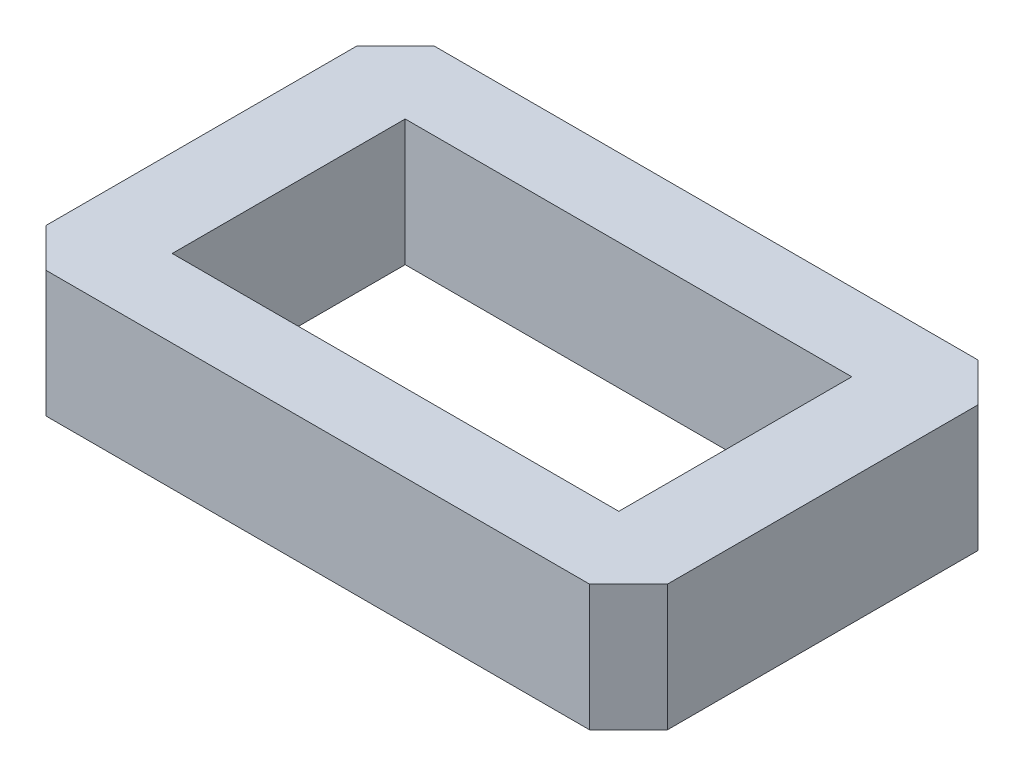
ISO-10303-21;
HEADER;
FILE_DESCRIPTION(('STEP AP214'),'2;1');
FILE_NAME('part.step','',(''),(''),'','','');
FILE_SCHEMA(('AUTOMOTIVE_DESIGN { 1 0 10303 214 1 1 1 1 }'));
ENDSEC;
DATA;
#1=APPLICATION_CONTEXT('core data for automotive mechanical design processes');
#2=APPLICATION_PROTOCOL_DEFINITION('international standard','automotive_design',2000,#1);
#3=PRODUCT_CONTEXT('',#1,'mechanical');
#4=PRODUCT('Part','Part','',(#3));
#5=PRODUCT_RELATED_PRODUCT_CATEGORY('part','',(#4));
#6=PRODUCT_DEFINITION_FORMATION('','',#4);
#7=PRODUCT_DEFINITION_CONTEXT('part definition',#1,'design');
#8=PRODUCT_DEFINITION('design','',#6,#7);
#9=PRODUCT_DEFINITION_SHAPE('','',#8);
#10=(LENGTH_UNIT() NAMED_UNIT(*) SI_UNIT(.MILLI.,.METRE.));
#11=(NAMED_UNIT(*) PLANE_ANGLE_UNIT() SI_UNIT($,.RADIAN.));
#12=(NAMED_UNIT(*) SI_UNIT($,.STERADIAN.) SOLID_ANGLE_UNIT());
#13=UNCERTAINTY_MEASURE_WITH_UNIT(LENGTH_MEASURE(1.E-05),#10,'distance_accuracy_value','');
#14=(GEOMETRIC_REPRESENTATION_CONTEXT(3) GLOBAL_UNCERTAINTY_ASSIGNED_CONTEXT((#13)) GLOBAL_UNIT_ASSIGNED_CONTEXT((#10,
#11,#12)) REPRESENTATION_CONTEXT('',''));
#15=CARTESIAN_POINT('',(0.,0.,0.));
#16=DIRECTION('',(0.,0.,1.));
#17=DIRECTION('',(1.,0.,0.));
#18=AXIS2_PLACEMENT_3D('',#15,#16,#17);
#19=CARTESIAN_POINT('',(0.,6.5,0.));
#20=DIRECTION('',(1.,0.,0.));
#21=DIRECTION('',(0.,0.,-1.));
#22=AXIS2_PLACEMENT_3D('',#19,#20,#21);
#23=PLANE('',#22);
#24=DIRECTION('',(0.,0.,1.));
#25=VECTOR('',#24,1.);
#26=CARTESIAN_POINT('',(0.,6.5,0.));
#27=LINE('',#26,#25);
#28=CARTESIAN_POINT('',(0.,6.5,-18.));
#29=VERTEX_POINT('',#28);
#30=CARTESIAN_POINT('',(0.,6.5,-2.));
#31=VERTEX_POINT('',#30);
#32=EDGE_CURVE('E197',#29,#31,#27,.T.);
#33=ORIENTED_EDGE('',*,*,#32,.F.);
#34=DIRECTION('',(0.,-1.,0.));
#35=VECTOR('',#34,1.);
#36=CARTESIAN_POINT('',(0.,6.5,-18.));
#37=LINE('',#36,#35);
#38=CARTESIAN_POINT('',(0.,0.,-18.));
#39=VERTEX_POINT('',#38);
#40=EDGE_CURVE('E228',#29,#39,#37,.T.);
#41=ORIENTED_EDGE('',*,*,#40,.T.);
#42=DIRECTION('',(0.,0.,1.));
#43=VECTOR('',#42,1.);
#44=CARTESIAN_POINT('',(0.,0.,0.));
#45=LINE('',#44,#43);
#46=CARTESIAN_POINT('',(0.,0.,-2.));
#47=VERTEX_POINT('',#46);
#48=EDGE_CURVE('E191',#39,#47,#45,.T.);
#49=ORIENTED_EDGE('',*,*,#48,.T.);
#50=DIRECTION('',(0.,1.,0.));
#51=VECTOR('',#50,1.);
#52=CARTESIAN_POINT('',(0.,6.5,-2.));
#53=LINE('',#52,#51);
#54=EDGE_CURVE('E212',#47,#31,#53,.T.);
#55=ORIENTED_EDGE('',*,*,#54,.T.);
#56=EDGE_LOOP('',(#33,#41,#49,#55));
#57=FACE_BOUND('',#56,.T.);
#58=ADVANCED_FACE('F49',(#57),#23,.F.);
#59=CARTESIAN_POINT('',(0.,6.5,0.));
#60=DIRECTION('',(0.,0.,-1.));
#61=DIRECTION('',(-1.,0.,0.));
#62=AXIS2_PLACEMENT_3D('',#59,#60,#61);
#63=PLANE('',#62);
#64=DIRECTION('',(1.,0.,0.));
#65=VECTOR('',#64,1.);
#66=CARTESIAN_POINT('',(0.,0.,0.));
#67=LINE('',#66,#65);
#68=CARTESIAN_POINT('',(2.,0.,0.));
#69=VERTEX_POINT('',#68);
#70=CARTESIAN_POINT('',(30.,0.,0.));
#71=VERTEX_POINT('',#70);
#72=EDGE_CURVE('E216',#69,#71,#67,.T.);
#73=ORIENTED_EDGE('',*,*,#72,.T.);
#74=DIRECTION('',(0.,1.,0.));
#75=VECTOR('',#74,1.);
#76=CARTESIAN_POINT('',(30.,6.5,0.));
#77=LINE('',#76,#75);
#78=CARTESIAN_POINT('',(30.,6.5,0.));
#79=VERTEX_POINT('',#78);
#80=EDGE_CURVE('E11',#71,#79,#77,.T.);
#81=ORIENTED_EDGE('',*,*,#80,.T.);
#82=DIRECTION('',(1.,0.,0.));
#83=VECTOR('',#82,1.);
#84=CARTESIAN_POINT('',(0.,6.5,0.));
#85=LINE('',#84,#83);
#86=CARTESIAN_POINT('',(2.,6.5,0.));
#87=VERTEX_POINT('',#86);
#88=EDGE_CURVE('E201',#87,#79,#85,.T.);
#89=ORIENTED_EDGE('',*,*,#88,.F.);
#90=DIRECTION('',(0.,-1.,0.));
#91=VECTOR('',#90,1.);
#92=CARTESIAN_POINT('',(2.,6.5,0.));
#93=LINE('',#92,#91);
#94=EDGE_CURVE('E59',#87,#69,#93,.T.);
#95=ORIENTED_EDGE('',*,*,#94,.T.);
#96=EDGE_LOOP('',(#73,#81,#89,#95));
#97=FACE_BOUND('',#96,.T.);
#98=ADVANCED_FACE('F273',(#97),#63,.F.);
#99=CARTESIAN_POINT('',(32.,6.5,0.));
#100=DIRECTION('',(-1.,0.,0.));
#101=DIRECTION('',(0.,0.,1.));
#102=AXIS2_PLACEMENT_3D('',#99,#100,#101);
#103=PLANE('',#102);
#104=DIRECTION('',(0.,0.,-1.));
#105=VECTOR('',#104,1.);
#106=CARTESIAN_POINT('',(32.,0.,0.));
#107=LINE('',#106,#105);
#108=CARTESIAN_POINT('',(32.,0.,-2.));
#109=VERTEX_POINT('',#108);
#110=CARTESIAN_POINT('',(32.,0.,-18.));
#111=VERTEX_POINT('',#110);
#112=EDGE_CURVE('E220',#109,#111,#107,.T.);
#113=ORIENTED_EDGE('',*,*,#112,.T.);
#114=DIRECTION('',(0.,1.,0.));
#115=VECTOR('',#114,1.);
#116=CARTESIAN_POINT('',(32.,6.5,-18.));
#117=LINE('',#116,#115);
#118=CARTESIAN_POINT('',(32.,6.5,-18.));
#119=VERTEX_POINT('',#118);
#120=EDGE_CURVE('E66',#111,#119,#117,.T.);
#121=ORIENTED_EDGE('',*,*,#120,.T.);
#122=DIRECTION('',(0.,0.,-1.));
#123=VECTOR('',#122,1.);
#124=CARTESIAN_POINT('',(32.,6.5,0.));
#125=LINE('',#124,#123);
#126=CARTESIAN_POINT('',(32.,6.5,-2.));
#127=VERTEX_POINT('',#126);
#128=EDGE_CURVE('E205',#127,#119,#125,.T.);
#129=ORIENTED_EDGE('',*,*,#128,.F.);
#130=DIRECTION('',(0.,-1.,0.));
#131=VECTOR('',#130,1.);
#132=CARTESIAN_POINT('',(32.,6.5,-2.));
#133=LINE('',#132,#131);
#134=EDGE_CURVE('E262',#127,#109,#133,.T.);
#135=ORIENTED_EDGE('',*,*,#134,.T.);
#136=EDGE_LOOP('',(#113,#121,#129,#135));
#137=FACE_BOUND('',#136,.T.);
#138=ADVANCED_FACE('F282',(#137),#103,.F.);
#139=CARTESIAN_POINT('',(0.,6.5,-20.));
#140=DIRECTION('',(0.,0.,1.));
#141=DIRECTION('',(1.,0.,0.));
#142=AXIS2_PLACEMENT_3D('',#139,#140,#141);
#143=PLANE('',#142);
#144=DIRECTION('',(-1.,0.,0.));
#145=VECTOR('',#144,1.);
#146=CARTESIAN_POINT('',(0.,0.,-20.));
#147=LINE('',#146,#145);
#148=CARTESIAN_POINT('',(30.,0.,-20.));
#149=VERTEX_POINT('',#148);
#150=CARTESIAN_POINT('',(2.,0.,-20.));
#151=VERTEX_POINT('',#150);
#152=EDGE_CURVE('E202',#149,#151,#147,.T.);
#153=ORIENTED_EDGE('',*,*,#152,.T.);
#154=DIRECTION('',(0.,1.,0.));
#155=VECTOR('',#154,1.);
#156=CARTESIAN_POINT('',(2.,6.5,-20.));
#157=LINE('',#156,#155);
#158=CARTESIAN_POINT('',(2.,6.5,-20.));
#159=VERTEX_POINT('',#158);
#160=EDGE_CURVE('E248',#151,#159,#157,.T.);
#161=ORIENTED_EDGE('',*,*,#160,.T.);
#162=DIRECTION('',(-1.,0.,0.));
#163=VECTOR('',#162,1.);
#164=CARTESIAN_POINT('',(0.,6.5,-20.));
#165=LINE('',#164,#163);
#166=CARTESIAN_POINT('',(30.,6.5,-20.));
#167=VERTEX_POINT('',#166);
#168=EDGE_CURVE('E208',#167,#159,#165,.T.);
#169=ORIENTED_EDGE('',*,*,#168,.F.);
#170=DIRECTION('',(0.,-1.,0.));
#171=VECTOR('',#170,1.);
#172=CARTESIAN_POINT('',(30.,6.5,-20.));
#173=LINE('',#172,#171);
#174=EDGE_CURVE('E244',#167,#149,#173,.T.);
#175=ORIENTED_EDGE('',*,*,#174,.T.);
#176=EDGE_LOOP('',(#153,#161,#169,#175));
#177=FACE_BOUND('',#176,.T.);
#178=ADVANCED_FACE('F291',(#177),#143,.F.);
#179=CARTESIAN_POINT('',(0.,6.5,0.));
#180=DIRECTION('',(0.,-1.,0.));
#181=DIRECTION('',(0.,0.,-1.));
#182=AXIS2_PLACEMENT_3D('',#179,#180,#181);
#183=PLANE('',#182);
#184=DIRECTION('',(-1.,0.,0.));
#185=VECTOR('',#184,1.);
#186=CARTESIAN_POINT('',(4.5,6.5,-16.));
#187=LINE('',#186,#185);
#188=CARTESIAN_POINT('',(27.5,6.5,-16.));
#189=VERTEX_POINT('',#188);
#190=CARTESIAN_POINT('',(4.5,6.5,-16.));
#191=VERTEX_POINT('',#190);
#192=EDGE_CURVE('E182',#189,#191,#187,.T.);
#193=ORIENTED_EDGE('',*,*,#192,.F.);
#194=DIRECTION('',(0.,0.,-1.));
#195=VECTOR('',#194,1.);
#196=CARTESIAN_POINT('',(27.5,6.5,-4.));
#197=LINE('',#196,#195);
#198=CARTESIAN_POINT('',(27.5,6.5,-4.));
#199=VERTEX_POINT('',#198);
#200=EDGE_CURVE('E148',#199,#189,#197,.T.);
#201=ORIENTED_EDGE('',*,*,#200,.F.);
#202=DIRECTION('',(1.,0.,0.));
#203=VECTOR('',#202,1.);
#204=CARTESIAN_POINT('',(4.5,6.5,-4.));
#205=LINE('',#204,#203);
#206=CARTESIAN_POINT('',(4.5,6.5,-4.));
#207=VERTEX_POINT('',#206);
#208=EDGE_CURVE('E169',#207,#199,#205,.T.);
#209=ORIENTED_EDGE('',*,*,#208,.F.);
#210=DIRECTION('',(0.,0.,1.));
#211=VECTOR('',#210,1.);
#212=CARTESIAN_POINT('',(4.5,6.5,-4.));
#213=LINE('',#212,#211);
#214=EDGE_CURVE('E173',#191,#207,#213,.T.);
#215=ORIENTED_EDGE('',*,*,#214,.F.);
#216=EDGE_LOOP('',(#193,#201,#209,#215));
#217=FACE_BOUND('',#216,.T.);
#218=ORIENTED_EDGE('',*,*,#168,.T.);
#219=DIRECTION('',(0.707106781186548,0.,-0.707106781186547));
#220=VECTOR('',#219,1.);
#221=CARTESIAN_POINT('',(0.,6.5,-18.));
#222=LINE('',#221,#220);
#223=EDGE_CURVE('E259',#159,#29,#222,.F.);
#224=ORIENTED_EDGE('',*,*,#223,.T.);
#225=ORIENTED_EDGE('',*,*,#32,.T.);
#226=DIRECTION('',(-0.707106781186546,0.,-0.707106781186549));
#227=VECTOR('',#226,1.);
#228=CARTESIAN_POINT('',(2.,6.5,0.));
#229=LINE('',#228,#227);
#230=EDGE_CURVE('E251',#31,#87,#229,.F.);
#231=ORIENTED_EDGE('',*,*,#230,.T.);
#232=ORIENTED_EDGE('',*,*,#88,.T.);
#233=DIRECTION('',(-0.707106781186549,0.,0.707106781186546));
#234=VECTOR('',#233,1.);
#235=CARTESIAN_POINT('',(32.,6.5,-2.));
#236=LINE('',#235,#234);
#237=EDGE_CURVE('E73',#79,#127,#236,.F.);
#238=ORIENTED_EDGE('',*,*,#237,.T.);
#239=ORIENTED_EDGE('',*,*,#128,.T.);
#240=DIRECTION('',(0.707106781186546,0.,0.707106781186549));
#241=VECTOR('',#240,1.);
#242=CARTESIAN_POINT('',(30.,6.5,-20.));
#243=LINE('',#242,#241);
#244=EDGE_CURVE('E256',#119,#167,#243,.F.);
#245=ORIENTED_EDGE('',*,*,#244,.T.);
#246=EDGE_LOOP('',(#218,#224,#225,#231,#232,#238,#239,#245));
#247=FACE_BOUND('',#246,.T.);
#248=ADVANCED_FACE('F284',(#217,#247),#183,.F.);
#249=CARTESIAN_POINT('',(0.,0.,0.));
#250=DIRECTION('',(0.,-1.,0.));
#251=DIRECTION('',(0.,0.,-1.));
#252=AXIS2_PLACEMENT_3D('',#249,#250,#251);
#253=PLANE('',#252);
#254=DIRECTION('',(0.,0.,-1.));
#255=VECTOR('',#254,1.);
#256=CARTESIAN_POINT('',(27.5,0.,-4.));
#257=LINE('',#256,#255);
#258=CARTESIAN_POINT('',(27.5,0.,-4.));
#259=VERTEX_POINT('',#258);
#260=CARTESIAN_POINT('',(27.5,0.,-16.));
#261=VERTEX_POINT('',#260);
#262=EDGE_CURVE('E145',#259,#261,#257,.T.);
#263=ORIENTED_EDGE('',*,*,#262,.T.);
#264=DIRECTION('',(-1.,0.,0.));
#265=VECTOR('',#264,1.);
#266=CARTESIAN_POINT('',(4.5,0.,-16.));
#267=LINE('',#266,#265);
#268=CARTESIAN_POINT('',(4.5,0.,-16.));
#269=VERTEX_POINT('',#268);
#270=EDGE_CURVE('E158',#261,#269,#267,.T.);
#271=ORIENTED_EDGE('',*,*,#270,.T.);
#272=DIRECTION('',(0.,0.,1.));
#273=VECTOR('',#272,1.);
#274=CARTESIAN_POINT('',(4.5,0.,-4.));
#275=LINE('',#274,#273);
#276=CARTESIAN_POINT('',(4.5,0.,-4.));
#277=VERTEX_POINT('',#276);
#278=EDGE_CURVE('E163',#269,#277,#275,.T.);
#279=ORIENTED_EDGE('',*,*,#278,.T.);
#280=DIRECTION('',(1.,0.,0.));
#281=VECTOR('',#280,1.);
#282=CARTESIAN_POINT('',(4.5,0.,-4.));
#283=LINE('',#282,#281);
#284=EDGE_CURVE('E154',#277,#259,#283,.T.);
#285=ORIENTED_EDGE('',*,*,#284,.T.);
#286=EDGE_LOOP('',(#263,#271,#279,#285));
#287=FACE_BOUND('',#286,.T.);
#288=ORIENTED_EDGE('',*,*,#48,.F.);
#289=DIRECTION('',(-0.707106781186548,0.,0.707106781186547));
#290=VECTOR('',#289,1.);
#291=CARTESIAN_POINT('',(-9.,0.,-9.00000000000001));
#292=LINE('',#291,#290);
#293=EDGE_CURVE('E241',#39,#151,#292,.F.);
#294=ORIENTED_EDGE('',*,*,#293,.T.);
#295=ORIENTED_EDGE('',*,*,#152,.F.);
#296=DIRECTION('',(-0.707106781186546,0.,-0.707106781186549));
#297=VECTOR('',#296,1.);
#298=CARTESIAN_POINT('',(25.0000000000001,0.,-25.));
#299=LINE('',#298,#297);
#300=EDGE_CURVE('E238',#149,#111,#299,.F.);
#301=ORIENTED_EDGE('',*,*,#300,.T.);
#302=ORIENTED_EDGE('',*,*,#112,.F.);
#303=DIRECTION('',(0.707106781186549,0.,-0.707106781186546));
#304=VECTOR('',#303,1.);
#305=CARTESIAN_POINT('',(14.9999999999999,0.,15.));
#306=LINE('',#305,#304);
#307=EDGE_CURVE('E235',#109,#71,#306,.F.);
#308=ORIENTED_EDGE('',*,*,#307,.T.);
#309=ORIENTED_EDGE('',*,*,#72,.F.);
#310=DIRECTION('',(0.707106781186546,0.,0.707106781186549));
#311=VECTOR('',#310,1.);
#312=CARTESIAN_POINT('',(1.,0.,-0.999999999999998));
#313=LINE('',#312,#311);
#314=EDGE_CURVE('E232',#69,#47,#313,.F.);
#315=ORIENTED_EDGE('',*,*,#314,.T.);
#316=EDGE_LOOP('',(#288,#294,#295,#301,#302,#308,#309,#315));
#317=FACE_BOUND('',#316,.T.);
#318=ADVANCED_FACE('F165',(#287,#317),#253,.T.);
#319=CARTESIAN_POINT('',(27.5,0.,-4.));
#320=DIRECTION('',(1.,0.,0.));
#321=DIRECTION('',(0.,0.,-1.));
#322=AXIS2_PLACEMENT_3D('',#319,#320,#321);
#323=PLANE('',#322);
#324=ORIENTED_EDGE('',*,*,#200,.T.);
#325=DIRECTION('',(0.,1.,0.));
#326=VECTOR('',#325,1.);
#327=CARTESIAN_POINT('',(27.5,0.,-16.));
#328=LINE('',#327,#326);
#329=EDGE_CURVE('E141',#261,#189,#328,.T.);
#330=ORIENTED_EDGE('',*,*,#329,.F.);
#331=ORIENTED_EDGE('',*,*,#262,.F.);
#332=DIRECTION('',(0.,1.,0.));
#333=VECTOR('',#332,1.);
#334=CARTESIAN_POINT('',(27.5,0.,-4.));
#335=LINE('',#334,#333);
#336=EDGE_CURVE('E188',#259,#199,#335,.T.);
#337=ORIENTED_EDGE('',*,*,#336,.T.);
#338=EDGE_LOOP('',(#324,#330,#331,#337));
#339=FACE_BOUND('',#338,.T.);
#340=ADVANCED_FACE('F143',(#339),#323,.F.);
#341=CARTESIAN_POINT('',(4.5,0.,-4.));
#342=DIRECTION('',(0.,0.,1.));
#343=DIRECTION('',(1.,0.,0.));
#344=AXIS2_PLACEMENT_3D('',#341,#342,#343);
#345=PLANE('',#344);
#346=ORIENTED_EDGE('',*,*,#208,.T.);
#347=ORIENTED_EDGE('',*,*,#336,.F.);
#348=ORIENTED_EDGE('',*,*,#284,.F.);
#349=DIRECTION('',(0.,1.,0.));
#350=VECTOR('',#349,1.);
#351=CARTESIAN_POINT('',(4.5,0.,-4.));
#352=LINE('',#351,#350);
#353=EDGE_CURVE('E192',#277,#207,#352,.T.);
#354=ORIENTED_EDGE('',*,*,#353,.T.);
#355=EDGE_LOOP('',(#346,#347,#348,#354));
#356=FACE_BOUND('',#355,.T.);
#357=ADVANCED_FACE('F362',(#356),#345,.F.);
#358=CARTESIAN_POINT('',(4.5,0.,-4.));
#359=DIRECTION('',(-1.,0.,0.));
#360=DIRECTION('',(0.,0.,1.));
#361=AXIS2_PLACEMENT_3D('',#358,#359,#360);
#362=PLANE('',#361);
#363=ORIENTED_EDGE('',*,*,#214,.T.);
#364=ORIENTED_EDGE('',*,*,#353,.F.);
#365=ORIENTED_EDGE('',*,*,#278,.F.);
#366=DIRECTION('',(0.,1.,0.));
#367=VECTOR('',#366,1.);
#368=CARTESIAN_POINT('',(4.5,0.,-16.));
#369=LINE('',#368,#367);
#370=EDGE_CURVE('E153',#269,#191,#369,.T.);
#371=ORIENTED_EDGE('',*,*,#370,.T.);
#372=EDGE_LOOP('',(#363,#364,#365,#371));
#373=FACE_BOUND('',#372,.T.);
#374=ADVANCED_FACE('F354',(#373),#362,.F.);
#375=CARTESIAN_POINT('',(4.5,0.,-16.));
#376=DIRECTION('',(0.,0.,-1.));
#377=DIRECTION('',(-1.,0.,0.));
#378=AXIS2_PLACEMENT_3D('',#375,#376,#377);
#379=PLANE('',#378);
#380=ORIENTED_EDGE('',*,*,#192,.T.);
#381=ORIENTED_EDGE('',*,*,#370,.F.);
#382=ORIENTED_EDGE('',*,*,#270,.F.);
#383=ORIENTED_EDGE('',*,*,#329,.T.);
#384=EDGE_LOOP('',(#380,#381,#382,#383));
#385=FACE_BOUND('',#384,.T.);
#386=ADVANCED_FACE('F159',(#385),#379,.F.);
#387=CARTESIAN_POINT('',(0.,6.5,-18.));
#388=DIRECTION('',(0.707106781186547,0.,0.707106781186548));
#389=DIRECTION('',(0.,-1.,0.));
#390=AXIS2_PLACEMENT_3D('',#387,#388,#389);
#391=PLANE('',#390);
#392=ORIENTED_EDGE('',*,*,#223,.F.);
#393=ORIENTED_EDGE('',*,*,#160,.F.);
#394=ORIENTED_EDGE('',*,*,#293,.F.);
#395=ORIENTED_EDGE('',*,*,#40,.F.);
#396=EDGE_LOOP('',(#392,#393,#394,#395));
#397=FACE_BOUND('',#396,.T.);
#398=ADVANCED_FACE('F296',(#397),#391,.F.);
#399=CARTESIAN_POINT('',(30.,6.5,-20.));
#400=DIRECTION('',(-0.707106781186549,0.,0.707106781186546));
#401=DIRECTION('',(0.,-1.,0.));
#402=AXIS2_PLACEMENT_3D('',#399,#400,#401);
#403=PLANE('',#402);
#404=ORIENTED_EDGE('',*,*,#244,.F.);
#405=ORIENTED_EDGE('',*,*,#120,.F.);
#406=ORIENTED_EDGE('',*,*,#300,.F.);
#407=ORIENTED_EDGE('',*,*,#174,.F.);
#408=EDGE_LOOP('',(#404,#405,#406,#407));
#409=FACE_BOUND('',#408,.T.);
#410=ADVANCED_FACE('F288',(#409),#403,.F.);
#411=CARTESIAN_POINT('',(32.,6.5,-2.));
#412=DIRECTION('',(-0.707106781186546,0.,-0.707106781186549));
#413=DIRECTION('',(0.,-1.,0.));
#414=AXIS2_PLACEMENT_3D('',#411,#412,#413);
#415=PLANE('',#414);
#416=ORIENTED_EDGE('',*,*,#237,.F.);
#417=ORIENTED_EDGE('',*,*,#80,.F.);
#418=ORIENTED_EDGE('',*,*,#307,.F.);
#419=ORIENTED_EDGE('',*,*,#134,.F.);
#420=EDGE_LOOP('',(#416,#417,#418,#419));
#421=FACE_BOUND('',#420,.T.);
#422=ADVANCED_FACE('F281',(#421),#415,.F.);
#423=CARTESIAN_POINT('',(2.,6.5,0.));
#424=DIRECTION('',(0.707106781186549,0.,-0.707106781186546));
#425=DIRECTION('',(0.,-1.,0.));
#426=AXIS2_PLACEMENT_3D('',#423,#424,#425);
#427=PLANE('',#426);
#428=ORIENTED_EDGE('',*,*,#230,.F.);
#429=ORIENTED_EDGE('',*,*,#54,.F.);
#430=ORIENTED_EDGE('',*,*,#314,.F.);
#431=ORIENTED_EDGE('',*,*,#94,.F.);
#432=EDGE_LOOP('',(#428,#429,#430,#431));
#433=FACE_BOUND('',#432,.T.);
#434=ADVANCED_FACE('F52',(#433),#427,.F.);
#435=CLOSED_SHELL('',(#58,#98,#138,#178,#248,#318,#340,#357,#374,#386,#398,#410,#422,#434));
#436=MANIFOLD_SOLID_BREP('B2',#435);
#437=ADVANCED_BREP_SHAPE_REPRESENTATION('',(#18,#436),#14);
#438=SHAPE_DEFINITION_REPRESENTATION(#9,#437);
ENDSEC;
END-ISO-10303-21;
